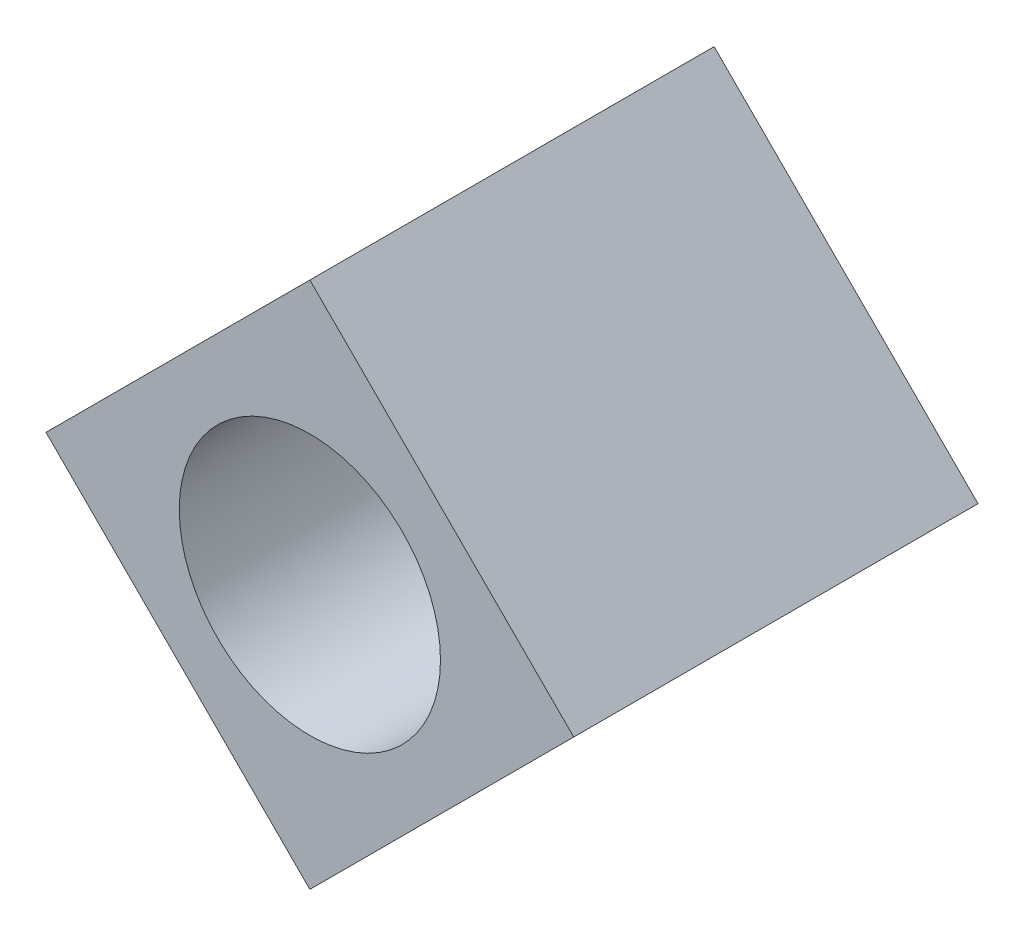
ISO-10303-21;
HEADER;
FILE_DESCRIPTION(('STEP AP214'),'2;1');
FILE_NAME('part.step','',(''),(''),'','','');
FILE_SCHEMA(('AUTOMOTIVE_DESIGN { 1 0 10303 214 1 1 1 1 }'));
ENDSEC;
DATA;
#1=APPLICATION_CONTEXT('core data for automotive mechanical design processes');
#2=APPLICATION_PROTOCOL_DEFINITION('international standard','automotive_design',2000,#1);
#3=PRODUCT_CONTEXT('',#1,'mechanical');
#4=PRODUCT('Part','Part','',(#3));
#5=PRODUCT_RELATED_PRODUCT_CATEGORY('part','',(#4));
#6=PRODUCT_DEFINITION_FORMATION('','',#4);
#7=PRODUCT_DEFINITION_CONTEXT('part definition',#1,'design');
#8=PRODUCT_DEFINITION('design','',#6,#7);
#9=PRODUCT_DEFINITION_SHAPE('','',#8);
#10=(LENGTH_UNIT() NAMED_UNIT(*) SI_UNIT(.MILLI.,.METRE.));
#11=(NAMED_UNIT(*) PLANE_ANGLE_UNIT() SI_UNIT($,.RADIAN.));
#12=(NAMED_UNIT(*) SI_UNIT($,.STERADIAN.) SOLID_ANGLE_UNIT());
#13=UNCERTAINTY_MEASURE_WITH_UNIT(LENGTH_MEASURE(1.E-05),#10,'distance_accuracy_value','');
#14=(GEOMETRIC_REPRESENTATION_CONTEXT(3) GLOBAL_UNCERTAINTY_ASSIGNED_CONTEXT((#13)) GLOBAL_UNIT_ASSIGNED_CONTEXT((#10,
#11,#12)) REPRESENTATION_CONTEXT('',''));
#15=CARTESIAN_POINT('',(0.,0.,0.));
#16=DIRECTION('',(0.,0.,1.));
#17=DIRECTION('',(1.,0.,0.));
#18=AXIS2_PLACEMENT_3D('',#15,#16,#17);
#19=CARTESIAN_POINT('',(0.,0.,6.5));
#20=DIRECTION('',(0.,0.,1.));
#21=DIRECTION('',(1.,0.,0.));
#22=AXIS2_PLACEMENT_3D('',#19,#20,#21);
#23=PLANE('',#22);
#24=DIRECTION('',(0.707106781186548,0.707106781186548,0.));
#25=VECTOR('',#24,1.);
#26=CARTESIAN_POINT('',(0.,-4.24264068711929,6.5));
#27=LINE('',#26,#25);
#28=CARTESIAN_POINT('',(0.,-4.24264068711929,6.5));
#29=VERTEX_POINT('',#28);
#30=CARTESIAN_POINT('',(4.24264068711929,0.,6.5));
#31=VERTEX_POINT('',#30);
#32=EDGE_CURVE('E85',#29,#31,#27,.T.);
#33=ORIENTED_EDGE('',*,*,#32,.T.);
#34=DIRECTION('',(-0.707106781186547,0.707106781186548,0.));
#35=VECTOR('',#34,1.);
#36=CARTESIAN_POINT('',(4.24264068711929,0.,6.5));
#37=LINE('',#36,#35);
#38=CARTESIAN_POINT('',(0.,4.24264068711928,6.5));
#39=VERTEX_POINT('',#38);
#40=EDGE_CURVE('E80',#31,#39,#37,.T.);
#41=ORIENTED_EDGE('',*,*,#40,.T.);
#42=DIRECTION('',(-0.707106781186548,-0.707106781186547,0.));
#43=VECTOR('',#42,1.);
#44=CARTESIAN_POINT('',(0.,4.24264068711928,6.5));
#45=LINE('',#44,#43);
#46=CARTESIAN_POINT('',(-4.24264068711929,0.,6.5));
#47=VERTEX_POINT('',#46);
#48=EDGE_CURVE('E83',#39,#47,#45,.T.);
#49=ORIENTED_EDGE('',*,*,#48,.T.);
#50=DIRECTION('',(0.707106781186548,-0.707106781186547,0.));
#51=VECTOR('',#50,1.);
#52=CARTESIAN_POINT('',(-4.24264068711929,0.,6.5));
#53=LINE('',#52,#51);
#54=EDGE_CURVE('E50',#47,#29,#53,.T.);
#55=ORIENTED_EDGE('',*,*,#54,.T.);
#56=EDGE_LOOP('',(#33,#41,#49,#55));
#57=FACE_BOUND('',#56,.T.);
#58=CARTESIAN_POINT('',(0.,0.,6.5));
#59=DIRECTION('',(0.,0.,1.));
#60=DIRECTION('',(1.,0.,0.));
#61=AXIS2_PLACEMENT_3D('',#58,#59,#60);
#62=CIRCLE('',#61,2.1);
#63=CARTESIAN_POINT('',(-2.1,0.,6.5));
#64=VERTEX_POINT('',#63);
#65=EDGE_CURVE('E100',#64,#64,#62,.T.);
#66=ORIENTED_EDGE('',*,*,#65,.F.);
#67=EDGE_LOOP('',(#66));
#68=FACE_BOUND('',#67,.T.);
#69=ADVANCED_FACE('F33',(#57,#68),#23,.T.);
#70=CARTESIAN_POINT('',(0.,0.,0.));
#71=DIRECTION('',(0.,0.,1.));
#72=DIRECTION('',(1.,0.,0.));
#73=AXIS2_PLACEMENT_3D('',#70,#71,#72);
#74=PLANE('',#73);
#75=DIRECTION('',(0.707106781186548,0.707106781186548,0.));
#76=VECTOR('',#75,1.);
#77=CARTESIAN_POINT('',(0.,-4.24264068711929,0.));
#78=LINE('',#77,#76);
#79=CARTESIAN_POINT('',(0.,-4.24264068711929,0.));
#80=VERTEX_POINT('',#79);
#81=CARTESIAN_POINT('',(4.24264068711929,0.,0.));
#82=VERTEX_POINT('',#81);
#83=EDGE_CURVE('E97',#80,#82,#78,.T.);
#84=ORIENTED_EDGE('',*,*,#83,.F.);
#85=DIRECTION('',(0.707106781186548,-0.707106781186547,0.));
#86=VECTOR('',#85,1.);
#87=CARTESIAN_POINT('',(-4.24264068711929,0.,0.));
#88=LINE('',#87,#86);
#89=CARTESIAN_POINT('',(-4.24264068711929,0.,0.));
#90=VERTEX_POINT('',#89);
#91=EDGE_CURVE('E73',#90,#80,#88,.T.);
#92=ORIENTED_EDGE('',*,*,#91,.F.);
#93=DIRECTION('',(-0.707106781186548,-0.707106781186547,0.));
#94=VECTOR('',#93,1.);
#95=CARTESIAN_POINT('',(0.,4.24264068711928,0.));
#96=LINE('',#95,#94);
#97=CARTESIAN_POINT('',(0.,4.24264068711928,0.));
#98=VERTEX_POINT('',#97);
#99=EDGE_CURVE('E67',#98,#90,#96,.T.);
#100=ORIENTED_EDGE('',*,*,#99,.F.);
#101=DIRECTION('',(-0.707106781186547,0.707106781186548,0.));
#102=VECTOR('',#101,1.);
#103=CARTESIAN_POINT('',(4.24264068711929,0.,0.));
#104=LINE('',#103,#102);
#105=EDGE_CURVE('E89',#82,#98,#104,.T.);
#106=ORIENTED_EDGE('',*,*,#105,.F.);
#107=EDGE_LOOP('',(#84,#92,#100,#106));
#108=FACE_BOUND('',#107,.T.);
#109=CARTESIAN_POINT('',(0.,0.,0.));
#110=DIRECTION('',(0.,0.,1.));
#111=DIRECTION('',(1.,0.,0.));
#112=AXIS2_PLACEMENT_3D('',#109,#110,#111);
#113=CIRCLE('',#112,2.1);
#114=CARTESIAN_POINT('',(-2.1,0.,0.));
#115=VERTEX_POINT('',#114);
#116=EDGE_CURVE('E112',#115,#115,#113,.T.);
#117=ORIENTED_EDGE('',*,*,#116,.T.);
#118=EDGE_LOOP('',(#117));
#119=FACE_BOUND('',#118,.T.);
#120=ADVANCED_FACE('F108',(#108,#119),#74,.F.);
#121=CARTESIAN_POINT('',(0.,-4.24264068711929,6.5));
#122=DIRECTION('',(-0.707106781186548,0.707106781186548,0.));
#123=DIRECTION('',(-0.707106781186548,-0.707106781186548,0.));
#124=AXIS2_PLACEMENT_3D('',#121,#122,#123);
#125=PLANE('',#124);
#126=ORIENTED_EDGE('',*,*,#83,.T.);
#127=DIRECTION('',(0.,0.,-1.));
#128=VECTOR('',#127,1.);
#129=CARTESIAN_POINT('',(4.24264068711929,0.,6.5));
#130=LINE('',#129,#128);
#131=EDGE_CURVE('E11',#31,#82,#130,.T.);
#132=ORIENTED_EDGE('',*,*,#131,.F.);
#133=ORIENTED_EDGE('',*,*,#32,.F.);
#134=DIRECTION('',(0.,0.,-1.));
#135=VECTOR('',#134,1.);
#136=CARTESIAN_POINT('',(0.,-4.24264068711929,6.5));
#137=LINE('',#136,#135);
#138=EDGE_CURVE('E93',#29,#80,#137,.T.);
#139=ORIENTED_EDGE('',*,*,#138,.T.);
#140=EDGE_LOOP('',(#126,#132,#133,#139));
#141=FACE_BOUND('',#140,.T.);
#142=ADVANCED_FACE('F35',(#141),#125,.F.);
#143=CARTESIAN_POINT('',(4.24264068711929,0.,6.5));
#144=DIRECTION('',(-0.707106781186548,-0.707106781186547,0.));
#145=DIRECTION('',(0.707106781186547,-0.707106781186548,0.));
#146=AXIS2_PLACEMENT_3D('',#143,#144,#145);
#147=PLANE('',#146);
#148=ORIENTED_EDGE('',*,*,#105,.T.);
#149=DIRECTION('',(0.,0.,-1.));
#150=VECTOR('',#149,1.);
#151=CARTESIAN_POINT('',(0.,4.24264068711928,6.5));
#152=LINE('',#151,#150);
#153=EDGE_CURVE('E42',#39,#98,#152,.T.);
#154=ORIENTED_EDGE('',*,*,#153,.F.);
#155=ORIENTED_EDGE('',*,*,#40,.F.);
#156=ORIENTED_EDGE('',*,*,#131,.T.);
#157=EDGE_LOOP('',(#148,#154,#155,#156));
#158=FACE_BOUND('',#157,.T.);
#159=ADVANCED_FACE('F88',(#158),#147,.F.);
#160=CARTESIAN_POINT('',(0.,4.24264068711928,6.5));
#161=DIRECTION('',(0.707106781186547,-0.707106781186548,0.));
#162=DIRECTION('',(0.707106781186548,0.707106781186547,0.));
#163=AXIS2_PLACEMENT_3D('',#160,#161,#162);
#164=PLANE('',#163);
#165=ORIENTED_EDGE('',*,*,#99,.T.);
#166=DIRECTION('',(0.,0.,-1.));
#167=VECTOR('',#166,1.);
#168=CARTESIAN_POINT('',(-4.24264068711929,0.,6.5));
#169=LINE('',#168,#167);
#170=EDGE_CURVE('E90',#47,#90,#169,.T.);
#171=ORIENTED_EDGE('',*,*,#170,.F.);
#172=ORIENTED_EDGE('',*,*,#48,.F.);
#173=ORIENTED_EDGE('',*,*,#153,.T.);
#174=EDGE_LOOP('',(#165,#171,#172,#173));
#175=FACE_BOUND('',#174,.T.);
#176=ADVANCED_FACE('F91',(#175),#164,.F.);
#177=CARTESIAN_POINT('',(-4.24264068711929,0.,6.5));
#178=DIRECTION('',(0.707106781186547,0.707106781186548,0.));
#179=DIRECTION('',(-0.707106781186548,0.707106781186547,0.));
#180=AXIS2_PLACEMENT_3D('',#177,#178,#179);
#181=PLANE('',#180);
#182=ORIENTED_EDGE('',*,*,#91,.T.);
#183=ORIENTED_EDGE('',*,*,#138,.F.);
#184=ORIENTED_EDGE('',*,*,#54,.F.);
#185=ORIENTED_EDGE('',*,*,#170,.T.);
#186=EDGE_LOOP('',(#182,#183,#184,#185));
#187=FACE_BOUND('',#186,.T.);
#188=ADVANCED_FACE('F105',(#187),#181,.F.);
#189=CARTESIAN_POINT('',(0.,0.,6.5));
#190=DIRECTION('',(0.,0.,-1.));
#191=DIRECTION('',(-1.,0.,0.));
#192=AXIS2_PLACEMENT_3D('',#189,#190,#191);
#193=CYLINDRICAL_SURFACE('',#192,2.1);
#194=CARTESIAN_POINT('',(-2.1,0.,6.5));
#195=CARTESIAN_POINT('',(-2.1,0.,6.43229166666667));
#196=CARTESIAN_POINT('',(-2.1,0.,6.36458333333333));
#197=CARTESIAN_POINT('',(-2.1,0.,6.22916666666667));
#198=CARTESIAN_POINT('',(-2.1,0.,6.16145833333333));
#199=CARTESIAN_POINT('',(-2.1,0.,6.02604166666667));
#200=CARTESIAN_POINT('',(-2.1,0.,5.95833333333333));
#201=CARTESIAN_POINT('',(-2.1,0.,5.82291666666667));
#202=CARTESIAN_POINT('',(-2.1,0.,5.75520833333333));
#203=CARTESIAN_POINT('',(-2.1,0.,5.61979166666667));
#204=CARTESIAN_POINT('',(-2.1,0.,5.55208333333333));
#205=CARTESIAN_POINT('',(-2.1,0.,5.41666666666667));
#206=CARTESIAN_POINT('',(-2.1,0.,5.34895833333333));
#207=CARTESIAN_POINT('',(-2.1,0.,5.21354166666667));
#208=CARTESIAN_POINT('',(-2.1,0.,5.14583333333333));
#209=CARTESIAN_POINT('',(-2.1,0.,5.01041666666667));
#210=CARTESIAN_POINT('',(-2.1,0.,4.94270833333333));
#211=CARTESIAN_POINT('',(-2.1,0.,4.80729166666667));
#212=CARTESIAN_POINT('',(-2.1,0.,4.73958333333333));
#213=CARTESIAN_POINT('',(-2.1,0.,4.60416666666667));
#214=CARTESIAN_POINT('',(-2.1,0.,4.53645833333333));
#215=CARTESIAN_POINT('',(-2.1,0.,4.40104166666667));
#216=CARTESIAN_POINT('',(-2.1,0.,4.33333333333333));
#217=CARTESIAN_POINT('',(-2.1,0.,4.19791666666667));
#218=CARTESIAN_POINT('',(-2.1,0.,4.13020833333333));
#219=CARTESIAN_POINT('',(-2.1,0.,3.99479166666667));
#220=CARTESIAN_POINT('',(-2.1,0.,3.92708333333333));
#221=CARTESIAN_POINT('',(-2.1,0.,3.79166666666667));
#222=CARTESIAN_POINT('',(-2.1,0.,3.72395833333333));
#223=CARTESIAN_POINT('',(-2.1,0.,3.58854166666667));
#224=CARTESIAN_POINT('',(-2.1,0.,3.52083333333333));
#225=CARTESIAN_POINT('',(-2.1,0.,3.38541666666667));
#226=CARTESIAN_POINT('',(-2.1,0.,3.31770833333333));
#227=CARTESIAN_POINT('',(-2.1,0.,3.18229166666667));
#228=CARTESIAN_POINT('',(-2.1,0.,3.11458333333333));
#229=CARTESIAN_POINT('',(-2.1,0.,2.97916666666667));
#230=CARTESIAN_POINT('',(-2.1,0.,2.91145833333333));
#231=CARTESIAN_POINT('',(-2.1,0.,2.77604166666667));
#232=CARTESIAN_POINT('',(-2.1,0.,2.70833333333333));
#233=CARTESIAN_POINT('',(-2.1,0.,2.57291666666667));
#234=CARTESIAN_POINT('',(-2.1,0.,2.50520833333333));
#235=CARTESIAN_POINT('',(-2.1,0.,2.36979166666667));
#236=CARTESIAN_POINT('',(-2.1,0.,2.30208333333333));
#237=CARTESIAN_POINT('',(-2.1,0.,2.16666666666667));
#238=CARTESIAN_POINT('',(-2.1,0.,2.09895833333333));
#239=CARTESIAN_POINT('',(-2.1,0.,1.96354166666667));
#240=CARTESIAN_POINT('',(-2.1,0.,1.89583333333333));
#241=CARTESIAN_POINT('',(-2.1,0.,1.76041666666667));
#242=CARTESIAN_POINT('',(-2.1,0.,1.69270833333333));
#243=CARTESIAN_POINT('',(-2.1,0.,1.55729166666667));
#244=CARTESIAN_POINT('',(-2.1,0.,1.48958333333333));
#245=CARTESIAN_POINT('',(-2.1,0.,1.35416666666667));
#246=CARTESIAN_POINT('',(-2.1,0.,1.28645833333333));
#247=CARTESIAN_POINT('',(-2.1,0.,1.15104166666667));
#248=CARTESIAN_POINT('',(-2.1,0.,1.08333333333333));
#249=CARTESIAN_POINT('',(-2.1,0.,0.947916666666667));
#250=CARTESIAN_POINT('',(-2.1,0.,0.880208333333333));
#251=CARTESIAN_POINT('',(-2.1,0.,0.744791666666667));
#252=CARTESIAN_POINT('',(-2.1,0.,0.677083333333333));
#253=CARTESIAN_POINT('',(-2.1,0.,0.541666666666667));
#254=CARTESIAN_POINT('',(-2.1,0.,0.473958333333333));
#255=CARTESIAN_POINT('',(-2.1,0.,0.338541666666667));
#256=CARTESIAN_POINT('',(-2.1,0.,0.270833333333334));
#257=CARTESIAN_POINT('',(-2.1,0.,0.135416666666667));
#258=CARTESIAN_POINT('',(-2.1,0.,0.0677083333333334));
#259=CARTESIAN_POINT('',(-2.1,0.,0.));
#260=B_SPLINE_CURVE_WITH_KNOTS('',3,(#194,#195,#196,#197,#198,#199,#200,#201,#202,#203,#204,
#205,#206,#207,#208,#209,#210,#211,#212,#213,#214,#215,#216,#217,#218,#219,#220,#221,#222,#223,
#224,#225,#226,#227,#228,#229,#230,#231,#232,#233,#234,#235,#236,#237,#238,#239,#240,#241,#242,
#243,#244,#245,#246,#247,#248,#249,#250,#251,#252,#253,#254,#255,#256,#257,#258,#259),
.UNSPECIFIED.,.F.,.F.,(4,2,2,2,2,2,2,2,2,2,2,2,2,2,2,2,2,2,2,2,2,2,2,2,2,2,2,2,2,2,2,2,4),(0.,
0.203125,0.40625,0.609375000000001,0.812500000000001,1.015625,1.21875,1.421875,1.625,1.828125,
2.03125,2.234375,2.4375,2.640625,2.84375,3.046875,3.25,3.453125,3.65625,3.859375,4.0625,
4.265625,4.46875,4.671875,4.875,5.078125,5.28125,5.484375,5.6875,5.890625,6.09375,6.296875,6.5),.UNSPECIFIED.);
#261=EDGE_CURVE('BSEAM118',#64,#115,#260,.T.);
#262=ORIENTED_EDGE('',*,*,#65,.T.);
#263=ORIENTED_EDGE('',*,*,#116,.F.);
#264=ORIENTED_EDGE('',*,*,#261,.T.);
#265=ORIENTED_EDGE('',*,*,#261,.F.);
#266=EDGE_LOOP('',(#262,#264,#263,#265));
#267=FACE_BOUND('',#266,.T.);
#268=ADVANCED_FACE('F118',(#267),#193,.F.);
#269=CLOSED_SHELL('',(#69,#120,#142,#159,#176,#188,#268));
#270=MANIFOLD_SOLID_BREP('B2',#269);
#271=ADVANCED_BREP_SHAPE_REPRESENTATION('',(#18,#270),#14);
#272=SHAPE_DEFINITION_REPRESENTATION(#9,#271);
ENDSEC;
END-ISO-10303-21;
